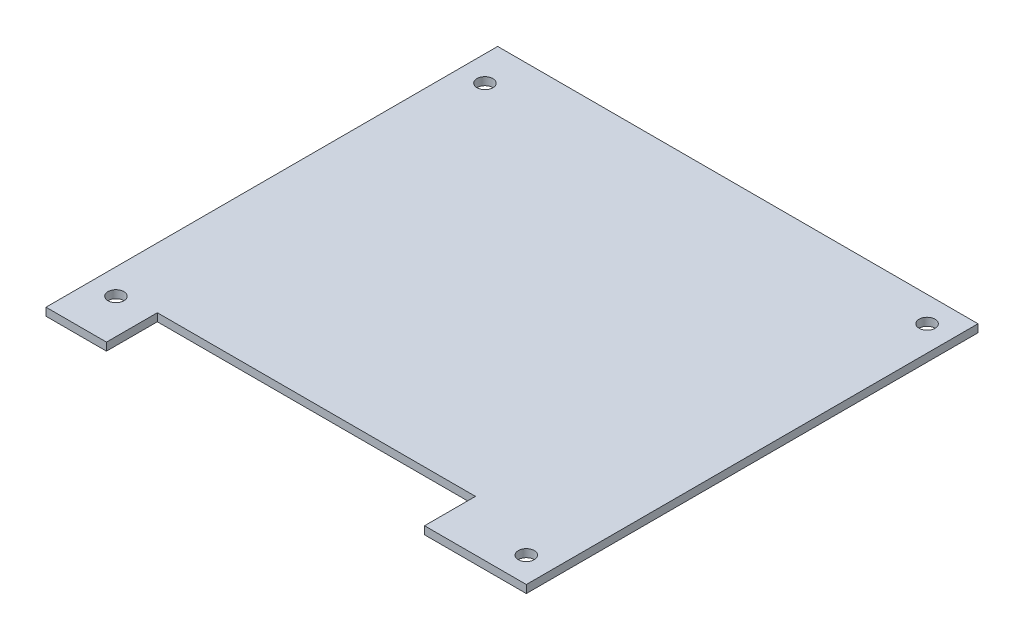
ISO-10303-21;
HEADER;
FILE_DESCRIPTION(('STEP AP214'),'2;1');
FILE_NAME('part.step','',(''),(''),'','','');
FILE_SCHEMA(('AUTOMOTIVE_DESIGN { 1 0 10303 214 1 1 1 1 }'));
ENDSEC;
DATA;
#1=APPLICATION_CONTEXT('core data for automotive mechanical design processes');
#2=APPLICATION_PROTOCOL_DEFINITION('international standard','automotive_design',2000,#1);
#3=PRODUCT_CONTEXT('',#1,'mechanical');
#4=PRODUCT('Part','Part','',(#3));
#5=PRODUCT_RELATED_PRODUCT_CATEGORY('part','',(#4));
#6=PRODUCT_DEFINITION_FORMATION('','',#4);
#7=PRODUCT_DEFINITION_CONTEXT('part definition',#1,'design');
#8=PRODUCT_DEFINITION('design','',#6,#7);
#9=PRODUCT_DEFINITION_SHAPE('','',#8);
#10=(LENGTH_UNIT() NAMED_UNIT(*) SI_UNIT(.MILLI.,.METRE.));
#11=(NAMED_UNIT(*) PLANE_ANGLE_UNIT() SI_UNIT($,.RADIAN.));
#12=(NAMED_UNIT(*) SI_UNIT($,.STERADIAN.) SOLID_ANGLE_UNIT());
#13=UNCERTAINTY_MEASURE_WITH_UNIT(LENGTH_MEASURE(1.E-05),#10,'distance_accuracy_value','');
#14=(GEOMETRIC_REPRESENTATION_CONTEXT(3) GLOBAL_UNCERTAINTY_ASSIGNED_CONTEXT((#13)) GLOBAL_UNIT_ASSIGNED_CONTEXT((#10,
#11,#12)) REPRESENTATION_CONTEXT('',''));
#15=CARTESIAN_POINT('',(0.,0.,0.));
#16=DIRECTION('',(0.,0.,1.));
#17=DIRECTION('',(1.,0.,0.));
#18=AXIS2_PLACEMENT_3D('',#15,#16,#17);
#19=CARTESIAN_POINT('',(-47.945,1.57,45.085));
#20=DIRECTION('',(1.,0.,0.));
#21=DIRECTION('',(0.,0.,-1.));
#22=AXIS2_PLACEMENT_3D('',#19,#20,#21);
#23=PLANE('',#22);
#24=DIRECTION('',(0.,0.,1.));
#25=VECTOR('',#24,1.);
#26=CARTESIAN_POINT('',(-47.945,0.,45.085));
#27=LINE('',#26,#25);
#28=CARTESIAN_POINT('',(-47.945,0.,-45.085));
#29=VERTEX_POINT('',#28);
#30=CARTESIAN_POINT('',(-47.945,0.,45.085));
#31=VERTEX_POINT('',#30);
#32=EDGE_CURVE('E128',#29,#31,#27,.T.);
#33=ORIENTED_EDGE('',*,*,#32,.T.);
#34=DIRECTION('',(0.,-1.,0.));
#35=VECTOR('',#34,1.);
#36=CARTESIAN_POINT('',(-47.945,1.57,45.085));
#37=LINE('',#36,#35);
#38=CARTESIAN_POINT('',(-47.945,1.57,45.085));
#39=VERTEX_POINT('',#38);
#40=EDGE_CURVE('E11',#39,#31,#37,.T.);
#41=ORIENTED_EDGE('',*,*,#40,.F.);
#42=DIRECTION('',(0.,0.,1.));
#43=VECTOR('',#42,1.);
#44=CARTESIAN_POINT('',(-47.945,1.57,45.085));
#45=LINE('',#44,#43);
#46=CARTESIAN_POINT('',(-47.945,1.57,-45.085));
#47=VERTEX_POINT('',#46);
#48=EDGE_CURVE('E143',#47,#39,#45,.T.);
#49=ORIENTED_EDGE('',*,*,#48,.F.);
#50=DIRECTION('',(0.,-1.,0.));
#51=VECTOR('',#50,1.);
#52=CARTESIAN_POINT('',(-47.945,1.57,-45.085));
#53=LINE('',#52,#51);
#54=EDGE_CURVE('E124',#47,#29,#53,.T.);
#55=ORIENTED_EDGE('',*,*,#54,.T.);
#56=EDGE_LOOP('',(#33,#41,#49,#55));
#57=FACE_BOUND('',#56,.T.);
#58=ADVANCED_FACE('F32',(#57),#23,.F.);
#59=CARTESIAN_POINT('',(-35.875,1.57,45.085));
#60=DIRECTION('',(0.,0.,-1.));
#61=DIRECTION('',(-1.,0.,0.));
#62=AXIS2_PLACEMENT_3D('',#59,#60,#61);
#63=PLANE('',#62);
#64=DIRECTION('',(1.,0.,0.));
#65=VECTOR('',#64,1.);
#66=CARTESIAN_POINT('',(-35.875,0.,45.085));
#67=LINE('',#66,#65);
#68=CARTESIAN_POINT('',(-35.875,0.,45.085));
#69=VERTEX_POINT('',#68);
#70=EDGE_CURVE('E131',#31,#69,#67,.T.);
#71=ORIENTED_EDGE('',*,*,#70,.T.);
#72=DIRECTION('',(0.,-1.,0.));
#73=VECTOR('',#72,1.);
#74=CARTESIAN_POINT('',(-35.875,1.57,45.085));
#75=LINE('',#74,#73);
#76=CARTESIAN_POINT('',(-35.875,1.57,45.085));
#77=VERTEX_POINT('',#76);
#78=EDGE_CURVE('E40',#77,#69,#75,.T.);
#79=ORIENTED_EDGE('',*,*,#78,.F.);
#80=DIRECTION('',(1.,0.,0.));
#81=VECTOR('',#80,1.);
#82=CARTESIAN_POINT('',(-35.875,1.57,45.085));
#83=LINE('',#82,#81);
#84=EDGE_CURVE('E91',#39,#77,#83,.T.);
#85=ORIENTED_EDGE('',*,*,#84,.F.);
#86=ORIENTED_EDGE('',*,*,#40,.T.);
#87=EDGE_LOOP('',(#71,#79,#85,#86));
#88=FACE_BOUND('',#87,.T.);
#89=ADVANCED_FACE('F233',(#88),#63,.F.);
#90=CARTESIAN_POINT('',(-35.875,1.57,45.085));
#91=DIRECTION('',(-1.,0.,0.));
#92=DIRECTION('',(0.,0.,1.));
#93=AXIS2_PLACEMENT_3D('',#90,#91,#92);
#94=PLANE('',#93);
#95=DIRECTION('',(0.,0.,-1.));
#96=VECTOR('',#95,1.);
#97=CARTESIAN_POINT('',(-35.875,0.,45.085));
#98=LINE('',#97,#96);
#99=CARTESIAN_POINT('',(-35.875,0.,34.925));
#100=VERTEX_POINT('',#99);
#101=EDGE_CURVE('E134',#69,#100,#98,.T.);
#102=ORIENTED_EDGE('',*,*,#101,.T.);
#103=DIRECTION('',(0.,-1.,0.));
#104=VECTOR('',#103,1.);
#105=CARTESIAN_POINT('',(-35.875,1.57,34.925));
#106=LINE('',#105,#104);
#107=CARTESIAN_POINT('',(-35.875,1.57,34.925));
#108=VERTEX_POINT('',#107);
#109=EDGE_CURVE('E150',#108,#100,#106,.T.);
#110=ORIENTED_EDGE('',*,*,#109,.F.);
#111=DIRECTION('',(0.,0.,-1.));
#112=VECTOR('',#111,1.);
#113=CARTESIAN_POINT('',(-35.875,1.57,45.085));
#114=LINE('',#113,#112);
#115=EDGE_CURVE('E158',#77,#108,#114,.T.);
#116=ORIENTED_EDGE('',*,*,#115,.F.);
#117=ORIENTED_EDGE('',*,*,#78,.T.);
#118=EDGE_LOOP('',(#102,#110,#116,#117));
#119=FACE_BOUND('',#118,.T.);
#120=ADVANCED_FACE('F156',(#119),#94,.F.);
#121=CARTESIAN_POINT('',(-35.875,1.57,34.925));
#122=DIRECTION('',(0.,0.,-1.));
#123=DIRECTION('',(-1.,0.,0.));
#124=AXIS2_PLACEMENT_3D('',#121,#122,#123);
#125=PLANE('',#124);
#126=DIRECTION('',(1.,0.,0.));
#127=VECTOR('',#126,1.);
#128=CARTESIAN_POINT('',(-35.875,0.,34.925));
#129=LINE('',#128,#127);
#130=CARTESIAN_POINT('',(27.625,0.,34.925));
#131=VERTEX_POINT('',#130);
#132=EDGE_CURVE('E136',#100,#131,#129,.T.);
#133=ORIENTED_EDGE('',*,*,#132,.T.);
#134=DIRECTION('',(0.,-1.,0.));
#135=VECTOR('',#134,1.);
#136=CARTESIAN_POINT('',(27.625,1.57,34.925));
#137=LINE('',#136,#135);
#138=CARTESIAN_POINT('',(27.625,1.57,34.925));
#139=VERTEX_POINT('',#138);
#140=EDGE_CURVE('E147',#139,#131,#137,.T.);
#141=ORIENTED_EDGE('',*,*,#140,.F.);
#142=DIRECTION('',(1.,0.,0.));
#143=VECTOR('',#142,1.);
#144=CARTESIAN_POINT('',(-35.875,1.57,34.925));
#145=LINE('',#144,#143);
#146=EDGE_CURVE('E170',#108,#139,#145,.T.);
#147=ORIENTED_EDGE('',*,*,#146,.F.);
#148=ORIENTED_EDGE('',*,*,#109,.T.);
#149=EDGE_LOOP('',(#133,#141,#147,#148));
#150=FACE_BOUND('',#149,.T.);
#151=ADVANCED_FACE('F166',(#150),#125,.F.);
#152=CARTESIAN_POINT('',(27.625,1.57,45.085));
#153=DIRECTION('',(1.,0.,0.));
#154=DIRECTION('',(0.,0.,-1.));
#155=AXIS2_PLACEMENT_3D('',#152,#153,#154);
#156=PLANE('',#155);
#157=DIRECTION('',(0.,0.,1.));
#158=VECTOR('',#157,1.);
#159=CARTESIAN_POINT('',(27.625,0.,45.085));
#160=LINE('',#159,#158);
#161=CARTESIAN_POINT('',(27.625,0.,45.085));
#162=VERTEX_POINT('',#161);
#163=EDGE_CURVE('E138',#131,#162,#160,.T.);
#164=ORIENTED_EDGE('',*,*,#163,.T.);
#165=DIRECTION('',(0.,-1.,0.));
#166=VECTOR('',#165,1.);
#167=CARTESIAN_POINT('',(27.625,1.57,45.085));
#168=LINE('',#167,#166);
#169=CARTESIAN_POINT('',(27.625,1.57,45.085));
#170=VERTEX_POINT('',#169);
#171=EDGE_CURVE('E119',#170,#162,#168,.T.);
#172=ORIENTED_EDGE('',*,*,#171,.F.);
#173=DIRECTION('',(0.,0.,1.));
#174=VECTOR('',#173,1.);
#175=CARTESIAN_POINT('',(27.625,1.57,45.085));
#176=LINE('',#175,#174);
#177=EDGE_CURVE('E110',#139,#170,#176,.T.);
#178=ORIENTED_EDGE('',*,*,#177,.F.);
#179=ORIENTED_EDGE('',*,*,#140,.T.);
#180=EDGE_LOOP('',(#164,#172,#178,#179));
#181=FACE_BOUND('',#180,.T.);
#182=ADVANCED_FACE('F169',(#181),#156,.F.);
#183=CARTESIAN_POINT('',(47.945,1.57,45.085));
#184=DIRECTION('',(0.,0.,-1.));
#185=DIRECTION('',(-1.,0.,0.));
#186=AXIS2_PLACEMENT_3D('',#183,#184,#185);
#187=PLANE('',#186);
#188=DIRECTION('',(1.,0.,0.));
#189=VECTOR('',#188,1.);
#190=CARTESIAN_POINT('',(47.945,0.,45.085));
#191=LINE('',#190,#189);
#192=CARTESIAN_POINT('',(47.945,0.,45.085));
#193=VERTEX_POINT('',#192);
#194=EDGE_CURVE('E118',#162,#193,#191,.T.);
#195=ORIENTED_EDGE('',*,*,#194,.T.);
#196=DIRECTION('',(0.,-1.,0.));
#197=VECTOR('',#196,1.);
#198=CARTESIAN_POINT('',(47.945,1.57,45.085));
#199=LINE('',#198,#197);
#200=CARTESIAN_POINT('',(47.945,1.57,45.085));
#201=VERTEX_POINT('',#200);
#202=EDGE_CURVE('E115',#201,#193,#199,.T.);
#203=ORIENTED_EDGE('',*,*,#202,.F.);
#204=DIRECTION('',(1.,0.,0.));
#205=VECTOR('',#204,1.);
#206=CARTESIAN_POINT('',(47.945,1.57,45.085));
#207=LINE('',#206,#205);
#208=EDGE_CURVE('E104',#170,#201,#207,.T.);
#209=ORIENTED_EDGE('',*,*,#208,.F.);
#210=ORIENTED_EDGE('',*,*,#171,.T.);
#211=EDGE_LOOP('',(#195,#203,#209,#210));
#212=FACE_BOUND('',#211,.T.);
#213=ADVANCED_FACE('F116',(#212),#187,.F.);
#214=CARTESIAN_POINT('',(47.945,1.57,45.085));
#215=DIRECTION('',(-1.,0.,0.));
#216=DIRECTION('',(0.,0.,1.));
#217=AXIS2_PLACEMENT_3D('',#214,#215,#216);
#218=PLANE('',#217);
#219=DIRECTION('',(0.,0.,-1.));
#220=VECTOR('',#219,1.);
#221=CARTESIAN_POINT('',(47.945,0.,45.085));
#222=LINE('',#221,#220);
#223=CARTESIAN_POINT('',(47.945,0.,-45.085));
#224=VERTEX_POINT('',#223);
#225=EDGE_CURVE('E77',#193,#224,#222,.T.);
#226=ORIENTED_EDGE('',*,*,#225,.T.);
#227=DIRECTION('',(0.,-1.,0.));
#228=VECTOR('',#227,1.);
#229=CARTESIAN_POINT('',(47.945,1.57,-45.085));
#230=LINE('',#229,#228);
#231=CARTESIAN_POINT('',(47.945,1.57,-45.085));
#232=VERTEX_POINT('',#231);
#233=EDGE_CURVE('E120',#232,#224,#230,.T.);
#234=ORIENTED_EDGE('',*,*,#233,.F.);
#235=DIRECTION('',(0.,0.,-1.));
#236=VECTOR('',#235,1.);
#237=CARTESIAN_POINT('',(47.945,1.57,45.085));
#238=LINE('',#237,#236);
#239=EDGE_CURVE('E108',#201,#232,#238,.T.);
#240=ORIENTED_EDGE('',*,*,#239,.F.);
#241=ORIENTED_EDGE('',*,*,#202,.T.);
#242=EDGE_LOOP('',(#226,#234,#240,#241));
#243=FACE_BOUND('',#242,.T.);
#244=ADVANCED_FACE('F122',(#243),#218,.F.);
#245=CARTESIAN_POINT('',(47.945,1.57,-45.085));
#246=DIRECTION('',(0.,0.,1.));
#247=DIRECTION('',(1.,0.,0.));
#248=AXIS2_PLACEMENT_3D('',#245,#246,#247);
#249=PLANE('',#248);
#250=DIRECTION('',(-1.,0.,0.));
#251=VECTOR('',#250,1.);
#252=CARTESIAN_POINT('',(47.945,0.,-45.085));
#253=LINE('',#252,#251);
#254=EDGE_CURVE('E83',#224,#29,#253,.T.);
#255=ORIENTED_EDGE('',*,*,#254,.T.);
#256=ORIENTED_EDGE('',*,*,#54,.F.);
#257=DIRECTION('',(-1.,0.,0.));
#258=VECTOR('',#257,1.);
#259=CARTESIAN_POINT('',(47.945,1.57,-45.085));
#260=LINE('',#259,#258);
#261=EDGE_CURVE('E48',#232,#47,#260,.T.);
#262=ORIENTED_EDGE('',*,*,#261,.F.);
#263=ORIENTED_EDGE('',*,*,#233,.T.);
#264=EDGE_LOOP('',(#255,#256,#262,#263));
#265=FACE_BOUND('',#264,.T.);
#266=ADVANCED_FACE('F211',(#265),#249,.F.);
#267=CARTESIAN_POINT('',(0.,1.57,0.));
#268=DIRECTION('',(0.,1.,0.));
#269=DIRECTION('',(0.,0.,1.));
#270=AXIS2_PLACEMENT_3D('',#267,#268,#269);
#271=PLANE('',#270);
#272=CARTESIAN_POINT('',(42.865,1.57,-40.005));
#273=DIRECTION('',(0.,1.,0.));
#274=DIRECTION('',(0.,0.,1.));
#275=AXIS2_PLACEMENT_3D('',#272,#273,#274);
#276=CIRCLE('',#275,1.59);
#277=CARTESIAN_POINT('',(42.865,1.57,-38.415));
#278=VERTEX_POINT('',#277);
#279=EDGE_CURVE('E194',#278,#278,#276,.T.);
#280=ORIENTED_EDGE('',*,*,#279,.F.);
#281=EDGE_LOOP('',(#280));
#282=FACE_BOUND('',#281,.T.);
#283=CARTESIAN_POINT('',(-42.865,1.57,-37.465));
#284=DIRECTION('',(0.,1.,0.));
#285=DIRECTION('',(0.,0.,1.));
#286=AXIS2_PLACEMENT_3D('',#283,#284,#285);
#287=CIRCLE('',#286,1.59);
#288=CARTESIAN_POINT('',(-42.865,1.57,-35.875));
#289=VERTEX_POINT('',#288);
#290=EDGE_CURVE('E188',#289,#289,#287,.T.);
#291=ORIENTED_EDGE('',*,*,#290,.F.);
#292=EDGE_LOOP('',(#291));
#293=FACE_BOUND('',#292,.T.);
#294=CARTESIAN_POINT('',(-42.865,1.57,36.195));
#295=DIRECTION('',(0.,1.,0.));
#296=DIRECTION('',(0.,0.,1.));
#297=AXIS2_PLACEMENT_3D('',#294,#295,#296);
#298=CIRCLE('',#297,1.59);
#299=CARTESIAN_POINT('',(-42.865,1.57,37.785));
#300=VERTEX_POINT('',#299);
#301=EDGE_CURVE('E182',#300,#300,#298,.T.);
#302=ORIENTED_EDGE('',*,*,#301,.F.);
#303=EDGE_LOOP('',(#302));
#304=FACE_BOUND('',#303,.T.);
#305=CARTESIAN_POINT('',(42.865,1.57,40.005));
#306=DIRECTION('',(0.,1.,0.));
#307=DIRECTION('',(0.,0.,1.));
#308=AXIS2_PLACEMENT_3D('',#305,#306,#307);
#309=CIRCLE('',#308,1.59);
#310=CARTESIAN_POINT('',(42.865,1.57,41.595));
#311=VERTEX_POINT('',#310);
#312=EDGE_CURVE('E176',#311,#311,#309,.T.);
#313=ORIENTED_EDGE('',*,*,#312,.F.);
#314=EDGE_LOOP('',(#313));
#315=FACE_BOUND('',#314,.T.);
#316=ORIENTED_EDGE('',*,*,#48,.T.);
#317=ORIENTED_EDGE('',*,*,#84,.T.);
#318=ORIENTED_EDGE('',*,*,#115,.T.);
#319=ORIENTED_EDGE('',*,*,#146,.T.);
#320=ORIENTED_EDGE('',*,*,#177,.T.);
#321=ORIENTED_EDGE('',*,*,#208,.T.);
#322=ORIENTED_EDGE('',*,*,#239,.T.);
#323=ORIENTED_EDGE('',*,*,#261,.T.);
#324=EDGE_LOOP('',(#316,#317,#318,#319,#320,#321,#322,#323));
#325=FACE_BOUND('',#324,.T.);
#326=ADVANCED_FACE('F106',(#282,#293,#304,#315,#325),#271,.T.);
#327=CARTESIAN_POINT('',(0.,0.,0.));
#328=DIRECTION('',(0.,1.,0.));
#329=DIRECTION('',(0.,0.,1.));
#330=AXIS2_PLACEMENT_3D('',#327,#328,#329);
#331=PLANE('',#330);
#332=CARTESIAN_POINT('',(42.865,0.,-40.005));
#333=DIRECTION('',(0.,1.,0.));
#334=DIRECTION('',(0.,0.,1.));
#335=AXIS2_PLACEMENT_3D('',#332,#333,#334);
#336=CIRCLE('',#335,1.59);
#337=CARTESIAN_POINT('',(42.865,0.,-38.415));
#338=VERTEX_POINT('',#337);
#339=EDGE_CURVE('E191',#338,#338,#336,.T.);
#340=ORIENTED_EDGE('',*,*,#339,.T.);
#341=EDGE_LOOP('',(#340));
#342=FACE_BOUND('',#341,.T.);
#343=CARTESIAN_POINT('',(-42.865,0.,-37.465));
#344=DIRECTION('',(0.,1.,0.));
#345=DIRECTION('',(0.,0.,1.));
#346=AXIS2_PLACEMENT_3D('',#343,#344,#345);
#347=CIRCLE('',#346,1.59);
#348=CARTESIAN_POINT('',(-42.865,0.,-35.875));
#349=VERTEX_POINT('',#348);
#350=EDGE_CURVE('E185',#349,#349,#347,.T.);
#351=ORIENTED_EDGE('',*,*,#350,.T.);
#352=EDGE_LOOP('',(#351));
#353=FACE_BOUND('',#352,.T.);
#354=CARTESIAN_POINT('',(-42.865,0.,36.195));
#355=DIRECTION('',(0.,1.,0.));
#356=DIRECTION('',(0.,0.,1.));
#357=AXIS2_PLACEMENT_3D('',#354,#355,#356);
#358=CIRCLE('',#357,1.59);
#359=CARTESIAN_POINT('',(-42.865,0.,37.785));
#360=VERTEX_POINT('',#359);
#361=EDGE_CURVE('E179',#360,#360,#358,.T.);
#362=ORIENTED_EDGE('',*,*,#361,.T.);
#363=EDGE_LOOP('',(#362));
#364=FACE_BOUND('',#363,.T.);
#365=CARTESIAN_POINT('',(42.865,0.,40.005));
#366=DIRECTION('',(0.,1.,0.));
#367=DIRECTION('',(0.,0.,1.));
#368=AXIS2_PLACEMENT_3D('',#365,#366,#367);
#369=CIRCLE('',#368,1.59);
#370=CARTESIAN_POINT('',(42.865,0.,41.595));
#371=VERTEX_POINT('',#370);
#372=EDGE_CURVE('E132',#371,#371,#369,.T.);
#373=ORIENTED_EDGE('',*,*,#372,.T.);
#374=EDGE_LOOP('',(#373));
#375=FACE_BOUND('',#374,.T.);
#376=ORIENTED_EDGE('',*,*,#32,.F.);
#377=ORIENTED_EDGE('',*,*,#254,.F.);
#378=ORIENTED_EDGE('',*,*,#225,.F.);
#379=ORIENTED_EDGE('',*,*,#194,.F.);
#380=ORIENTED_EDGE('',*,*,#163,.F.);
#381=ORIENTED_EDGE('',*,*,#132,.F.);
#382=ORIENTED_EDGE('',*,*,#101,.F.);
#383=ORIENTED_EDGE('',*,*,#70,.F.);
#384=EDGE_LOOP('',(#376,#377,#378,#379,#380,#381,#382,#383));
#385=FACE_BOUND('',#384,.T.);
#386=ADVANCED_FACE('F162',(#342,#353,#364,#375,#385),#331,.F.);
#387=CARTESIAN_POINT('',(42.865,0.,40.005));
#388=DIRECTION('',(0.,1.,0.));
#389=DIRECTION('',(0.,0.,1.));
#390=AXIS2_PLACEMENT_3D('',#387,#388,#389);
#391=CYLINDRICAL_SURFACE('',#390,1.59);
#392=ORIENTED_EDGE('',*,*,#372,.F.);
#393=EDGE_LOOP('',(#392));
#394=FACE_BOUND('',#393,.T.);
#395=ORIENTED_EDGE('',*,*,#312,.T.);
#396=EDGE_LOOP('',(#395));
#397=FACE_BOUND('',#396,.T.);
#398=ADVANCED_FACE('F219',(#394,#397),#391,.F.);
#399=CARTESIAN_POINT('',(-42.865,0.,36.195));
#400=DIRECTION('',(0.,1.,0.));
#401=DIRECTION('',(0.,0.,1.));
#402=AXIS2_PLACEMENT_3D('',#399,#400,#401);
#403=CYLINDRICAL_SURFACE('',#402,1.59);
#404=ORIENTED_EDGE('',*,*,#361,.F.);
#405=EDGE_LOOP('',(#404));
#406=FACE_BOUND('',#405,.T.);
#407=ORIENTED_EDGE('',*,*,#301,.T.);
#408=EDGE_LOOP('',(#407));
#409=FACE_BOUND('',#408,.T.);
#410=ADVANCED_FACE('F221',(#406,#409),#403,.F.);
#411=CARTESIAN_POINT('',(-42.865,0.,-37.465));
#412=DIRECTION('',(0.,1.,0.));
#413=DIRECTION('',(0.,0.,1.));
#414=AXIS2_PLACEMENT_3D('',#411,#412,#413);
#415=CYLINDRICAL_SURFACE('',#414,1.59);
#416=ORIENTED_EDGE('',*,*,#350,.F.);
#417=EDGE_LOOP('',(#416));
#418=FACE_BOUND('',#417,.T.);
#419=ORIENTED_EDGE('',*,*,#290,.T.);
#420=EDGE_LOOP('',(#419));
#421=FACE_BOUND('',#420,.T.);
#422=ADVANCED_FACE('F205',(#418,#421),#415,.F.);
#423=CARTESIAN_POINT('',(42.865,0.,-40.005));
#424=DIRECTION('',(0.,1.,0.));
#425=DIRECTION('',(0.,0.,1.));
#426=AXIS2_PLACEMENT_3D('',#423,#424,#425);
#427=CYLINDRICAL_SURFACE('',#426,1.59);
#428=ORIENTED_EDGE('',*,*,#339,.F.);
#429=EDGE_LOOP('',(#428));
#430=FACE_BOUND('',#429,.T.);
#431=ORIENTED_EDGE('',*,*,#279,.T.);
#432=EDGE_LOOP('',(#431));
#433=FACE_BOUND('',#432,.T.);
#434=ADVANCED_FACE('F202',(#430,#433),#427,.F.);
#435=CLOSED_SHELL('',(#58,#89,#120,#151,#182,#213,#244,#266,#326,#386,#398,#410,#422,#434));
#436=MANIFOLD_SOLID_BREP('B2',#435);
#437=ADVANCED_BREP_SHAPE_REPRESENTATION('',(#18,#436),#14);
#438=SHAPE_DEFINITION_REPRESENTATION(#9,#437);
ENDSEC;
END-ISO-10303-21;
